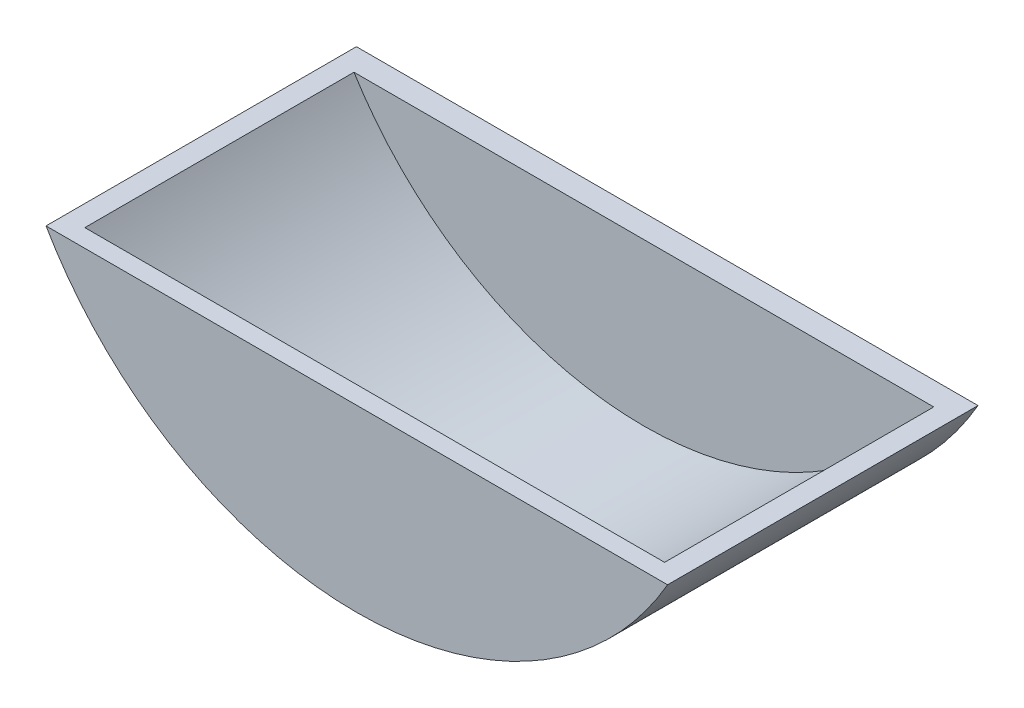
ISO-10303-21;
HEADER;
FILE_DESCRIPTION(('STEP AP214'),'2;1');
FILE_NAME('part.step','',(''),(''),'','','');
FILE_SCHEMA(('AUTOMOTIVE_DESIGN { 1 0 10303 214 1 1 1 1 }'));
ENDSEC;
DATA;
#1=APPLICATION_CONTEXT('core data for automotive mechanical design processes');
#2=APPLICATION_PROTOCOL_DEFINITION('international standard','automotive_design',2000,#1);
#3=PRODUCT_CONTEXT('',#1,'mechanical');
#4=PRODUCT('Part','Part','',(#3));
#5=PRODUCT_RELATED_PRODUCT_CATEGORY('part','',(#4));
#6=PRODUCT_DEFINITION_FORMATION('','',#4);
#7=PRODUCT_DEFINITION_CONTEXT('part definition',#1,'design');
#8=PRODUCT_DEFINITION('design','',#6,#7);
#9=PRODUCT_DEFINITION_SHAPE('','',#8);
#10=(LENGTH_UNIT() NAMED_UNIT(*) SI_UNIT(.MILLI.,.METRE.));
#11=(NAMED_UNIT(*) PLANE_ANGLE_UNIT() SI_UNIT($,.RADIAN.));
#12=(NAMED_UNIT(*) SI_UNIT($,.STERADIAN.) SOLID_ANGLE_UNIT());
#13=UNCERTAINTY_MEASURE_WITH_UNIT(LENGTH_MEASURE(1.E-05),#10,'distance_accuracy_value','');
#14=(GEOMETRIC_REPRESENTATION_CONTEXT(3) GLOBAL_UNCERTAINTY_ASSIGNED_CONTEXT((#13)) GLOBAL_UNIT_ASSIGNED_CONTEXT((#10,
#11,#12)) REPRESENTATION_CONTEXT('',''));
#15=CARTESIAN_POINT('',(0.,0.,0.));
#16=DIRECTION('',(0.,0.,1.));
#17=DIRECTION('',(1.,0.,0.));
#18=AXIS2_PLACEMENT_3D('',#15,#16,#17);
#19=CARTESIAN_POINT('',(0.,0.,-13.));
#20=DIRECTION('',(0.,0.,-1.));
#21=DIRECTION('',(-1.,0.,0.));
#22=AXIS2_PLACEMENT_3D('',#19,#20,#21);
#23=PLANE('',#22);
#24=CARTESIAN_POINT('',(0.,0.,-13.));
#25=DIRECTION('',(0.,0.,-1.));
#26=DIRECTION('',(-1.,0.,0.));
#27=AXIS2_PLACEMENT_3D('',#24,#25,#26);
#28=CIRCLE('',#27,200.);
#29=CARTESIAN_POINT('',(173.205080756888,-100.,-13.));
#30=VERTEX_POINT('',#29);
#31=CARTESIAN_POINT('',(-173.205080756888,-100.,-13.));
#32=VERTEX_POINT('',#31);
#33=EDGE_CURVE('E127',#30,#32,#28,.T.);
#34=ORIENTED_EDGE('',*,*,#33,.T.);
#35=DIRECTION('',(1.,0.,0.));
#36=VECTOR('',#35,1.);
#37=CARTESIAN_POINT('',(173.205080756888,-100.,-13.));
#38=LINE('',#37,#36);
#39=EDGE_CURVE('E152',#32,#30,#38,.T.);
#40=ORIENTED_EDGE('',*,*,#39,.T.);
#41=EDGE_LOOP('',(#34,#40));
#42=FACE_BOUND('',#41,.T.);
#43=DIRECTION('',(-1.,0.,0.));
#44=VECTOR('',#43,1.);
#45=CARTESIAN_POINT('',(-25.0000000000001,-134.311563909938,-13.));
#46=LINE('',#45,#44);
#47=CARTESIAN_POINT('',(25.9999999999999,-134.311563909938,-13.));
#48=VERTEX_POINT('',#47);
#49=CARTESIAN_POINT('',(-26.0000000000001,-134.311563909938,-13.));
#50=VERTEX_POINT('',#49);
#51=EDGE_CURVE('E173',#48,#50,#46,.T.);
#52=ORIENTED_EDGE('',*,*,#51,.T.);
#53=DIRECTION('',(0.,1.,0.));
#54=VECTOR('',#53,1.);
#55=CARTESIAN_POINT('',(-26.0000000000001,-150.293943782804,-13.));
#56=LINE('',#55,#54);
#57=CARTESIAN_POINT('',(-26.0000000000001,-151.293943782804,-13.));
#58=VERTEX_POINT('',#57);
#59=EDGE_CURVE('E189',#50,#58,#56,.F.);
#60=ORIENTED_EDGE('',*,*,#59,.T.);
#61=DIRECTION('',(-1.,0.,0.));
#62=VECTOR('',#61,1.);
#63=CARTESIAN_POINT('',(24.9999999999999,-151.293943782804,-13.));
#64=LINE('',#63,#62);
#65=CARTESIAN_POINT('',(25.9999999999999,-151.293943782804,-13.));
#66=VERTEX_POINT('',#65);
#67=EDGE_CURVE('E187',#58,#66,#64,.F.);
#68=ORIENTED_EDGE('',*,*,#67,.T.);
#69=DIRECTION('',(0.,1.,0.));
#70=VECTOR('',#69,1.);
#71=CARTESIAN_POINT('',(25.9999999999999,0.,-13.));
#72=LINE('',#71,#70);
#73=EDGE_CURVE('E184',#66,#48,#72,.T.);
#74=ORIENTED_EDGE('',*,*,#73,.T.);
#75=EDGE_LOOP('',(#52,#60,#68,#74));
#76=FACE_BOUND('',#75,.T.);
#77=ADVANCED_FACE('F41',(#42,#76),#23,.T.);
#78=CARTESIAN_POINT('',(0.,0.,150.));
#79=DIRECTION('',(0.,0.,-1.));
#80=DIRECTION('',(-1.,0.,0.));
#81=AXIS2_PLACEMENT_3D('',#78,#79,#80);
#82=CYLINDRICAL_SURFACE('',#81,190.);
#83=CARTESIAN_POINT('',(0.,0.,0.));
#84=DIRECTION('',(0.,0.,1.));
#85=DIRECTION('',(1.,0.,0.));
#86=AXIS2_PLACEMENT_3D('',#83,#84,#85);
#87=CIRCLE('',#86,190.);
#88=CARTESIAN_POINT('',(-161.554944214035,-100.,0.));
#89=VERTEX_POINT('',#88);
#90=CARTESIAN_POINT('',(161.554944214035,-100.,0.));
#91=VERTEX_POINT('',#90);
#92=EDGE_CURVE('E154',#89,#91,#87,.T.);
#93=ORIENTED_EDGE('',*,*,#92,.F.);
#94=DIRECTION('',(0.,0.,-1.));
#95=VECTOR('',#94,1.);
#96=CARTESIAN_POINT('',(-161.554944214035,-100.,150.));
#97=LINE('',#96,#95);
#98=CARTESIAN_POINT('',(-161.554944214035,-100.,150.));
#99=VERTEX_POINT('',#98);
#100=EDGE_CURVE('E164',#99,#89,#97,.T.);
#101=ORIENTED_EDGE('',*,*,#100,.F.);
#102=CARTESIAN_POINT('',(0.,0.,150.));
#103=DIRECTION('',(0.,0.,1.));
#104=DIRECTION('',(1.,0.,0.));
#105=AXIS2_PLACEMENT_3D('',#102,#103,#104);
#106=CIRCLE('',#105,190.);
#107=CARTESIAN_POINT('',(161.554944214035,-100.,150.));
#108=VERTEX_POINT('',#107);
#109=EDGE_CURVE('E157',#99,#108,#106,.T.);
#110=ORIENTED_EDGE('',*,*,#109,.T.);
#111=DIRECTION('',(0.,0.,-1.));
#112=VECTOR('',#111,1.);
#113=CARTESIAN_POINT('',(161.554944214035,-100.,150.));
#114=LINE('',#113,#112);
#115=EDGE_CURVE('E132',#108,#91,#114,.T.);
#116=ORIENTED_EDGE('',*,*,#115,.T.);
#117=EDGE_LOOP('',(#93,#101,#110,#116));
#118=FACE_BOUND('',#117,.T.);
#119=ADVANCED_FACE('F221',(#118),#82,.F.);
#120=CARTESIAN_POINT('',(0.,0.,150.));
#121=DIRECTION('',(0.,0.,-1.));
#122=DIRECTION('',(-1.,0.,0.));
#123=AXIS2_PLACEMENT_3D('',#120,#121,#122);
#124=CYLINDRICAL_SURFACE('',#123,200.);
#125=DIRECTION('',(0.,0.,-1.));
#126=VECTOR('',#125,1.);
#127=CARTESIAN_POINT('',(-173.205080756888,-100.,150.));
#128=LINE('',#127,#126);
#129=CARTESIAN_POINT('',(-173.205080756888,-100.,160.));
#130=VERTEX_POINT('',#129);
#131=EDGE_CURVE('E131',#130,#32,#128,.T.);
#132=ORIENTED_EDGE('',*,*,#131,.T.);
#133=ORIENTED_EDGE('',*,*,#33,.F.);
#134=DIRECTION('',(0.,0.,-1.));
#135=VECTOR('',#134,1.);
#136=CARTESIAN_POINT('',(173.205080756888,-100.,150.));
#137=LINE('',#136,#135);
#138=CARTESIAN_POINT('',(173.205080756888,-100.,160.));
#139=VERTEX_POINT('',#138);
#140=EDGE_CURVE('E121',#139,#30,#137,.T.);
#141=ORIENTED_EDGE('',*,*,#140,.F.);
#142=CARTESIAN_POINT('',(0.,0.,160.));
#143=DIRECTION('',(0.,0.,1.));
#144=DIRECTION('',(1.,0.,0.));
#145=AXIS2_PLACEMENT_3D('',#142,#143,#144);
#146=CIRCLE('',#145,200.);
#147=EDGE_CURVE('E125',#130,#139,#146,.T.);
#148=ORIENTED_EDGE('',*,*,#147,.F.);
#149=EDGE_LOOP('',(#132,#133,#141,#148));
#150=FACE_BOUND('',#149,.T.);
#151=ADVANCED_FACE('F123',(#150),#124,.T.);
#152=CARTESIAN_POINT('',(0.,-100.,150.));
#153=DIRECTION('',(0.,1.,0.));
#154=DIRECTION('',(-1.,0.,0.));
#155=AXIS2_PLACEMENT_3D('',#152,#153,#154);
#156=PLANE('',#155);
#157=ORIENTED_EDGE('',*,*,#131,.F.);
#158=DIRECTION('',(-1.,0.,0.));
#159=VECTOR('',#158,1.);
#160=CARTESIAN_POINT('',(-173.205080756888,-100.,160.));
#161=LINE('',#160,#159);
#162=EDGE_CURVE('E135',#139,#130,#161,.T.);
#163=ORIENTED_EDGE('',*,*,#162,.F.);
#164=ORIENTED_EDGE('',*,*,#140,.T.);
#165=ORIENTED_EDGE('',*,*,#39,.F.);
#166=EDGE_LOOP('',(#157,#163,#164,#165));
#167=FACE_BOUND('',#166,.T.);
#168=DIRECTION('',(-1.,0.,0.));
#169=VECTOR('',#168,1.);
#170=CARTESIAN_POINT('',(-173.205080756888,-100.,150.));
#171=LINE('',#170,#169);
#172=EDGE_CURVE('E142',#108,#99,#171,.T.);
#173=ORIENTED_EDGE('',*,*,#172,.T.);
#174=ORIENTED_EDGE('',*,*,#100,.T.);
#175=DIRECTION('',(1.,0.,0.));
#176=VECTOR('',#175,1.);
#177=CARTESIAN_POINT('',(173.205080756888,-100.,0.));
#178=LINE('',#177,#176);
#179=EDGE_CURVE('E139',#89,#91,#178,.T.);
#180=ORIENTED_EDGE('',*,*,#179,.T.);
#181=ORIENTED_EDGE('',*,*,#115,.F.);
#182=EDGE_LOOP('',(#173,#174,#180,#181));
#183=FACE_BOUND('',#182,.T.);
#184=ADVANCED_FACE('F136',(#167,#183),#156,.T.);
#185=CARTESIAN_POINT('',(0.,0.,0.));
#186=DIRECTION('',(0.,0.,-1.));
#187=DIRECTION('',(-1.,0.,0.));
#188=AXIS2_PLACEMENT_3D('',#185,#186,#187);
#189=PLANE('',#188);
#190=ORIENTED_EDGE('',*,*,#179,.F.);
#191=ORIENTED_EDGE('',*,*,#92,.T.);
#192=EDGE_LOOP('',(#190,#191));
#193=FACE_BOUND('',#192,.T.);
#194=ADVANCED_FACE('F233',(#193),#189,.F.);
#195=CARTESIAN_POINT('',(0.,0.,150.));
#196=DIRECTION('',(0.,0.,1.));
#197=DIRECTION('',(1.,0.,0.));
#198=AXIS2_PLACEMENT_3D('',#195,#196,#197);
#199=PLANE('',#198);
#200=ORIENTED_EDGE('',*,*,#109,.F.);
#201=ORIENTED_EDGE('',*,*,#172,.F.);
#202=EDGE_LOOP('',(#200,#201));
#203=FACE_BOUND('',#202,.T.);
#204=ADVANCED_FACE('F231',(#203),#199,.F.);
#205=CARTESIAN_POINT('',(0.,0.,160.));
#206=DIRECTION('',(0.,0.,1.));
#207=DIRECTION('',(1.,0.,0.));
#208=AXIS2_PLACEMENT_3D('',#205,#206,#207);
#209=PLANE('',#208);
#210=ORIENTED_EDGE('',*,*,#147,.T.);
#211=ORIENTED_EDGE('',*,*,#162,.T.);
#212=EDGE_LOOP('',(#210,#211));
#213=FACE_BOUND('',#212,.T.);
#214=ADVANCED_FACE('F141',(#213),#209,.T.);
#215=CARTESIAN_POINT('',(-25.0000000000001,0.,-3.));
#216=DIRECTION('',(-1.,0.,0.));
#217=DIRECTION('',(0.,0.,1.));
#218=AXIS2_PLACEMENT_3D('',#215,#216,#217);
#219=PLANE('',#218);
#220=DIRECTION('',(0.,0.,-1.));
#221=VECTOR('',#220,1.);
#222=CARTESIAN_POINT('',(-25.0000000000001,-150.293943782804,-3.));
#223=LINE('',#222,#221);
#224=CARTESIAN_POINT('',(-25.0000000000001,-150.293943782804,-3.00067343296818));
#225=VERTEX_POINT('',#224);
#226=CARTESIAN_POINT('',(-25.0000000000001,-150.293943782804,-12.));
#227=VERTEX_POINT('',#226);
#228=EDGE_CURVE('E145',#225,#227,#223,.T.);
#229=ORIENTED_EDGE('',*,*,#228,.T.);
#230=DIRECTION('',(0.,1.,0.));
#231=VECTOR('',#230,1.);
#232=CARTESIAN_POINT('',(-25.0000000000001,-134.311563909938,-12.));
#233=LINE('',#232,#231);
#234=CARTESIAN_POINT('',(-25.0000000000001,-136.547631887437,-12.));
#235=VERTEX_POINT('',#234);
#236=EDGE_CURVE('E65',#227,#235,#233,.T.);
#237=ORIENTED_EDGE('',*,*,#236,.T.);
#238=CARTESIAN_POINT('',(-25.0000000000001,-134.311563909938,-10.));
#239=DIRECTION('',(-1.,0.,0.));
#240=DIRECTION('',(0.,0.,1.));
#241=AXIS2_PLACEMENT_3D('',#238,#239,#240);
#242=CIRCLE('',#241,3.);
#243=CARTESIAN_POINT('',(-25.0000000000001,-136.998983159371,-11.3333333333333));
#244=VERTEX_POINT('',#243);
#245=EDGE_CURVE('E177',#235,#244,#242,.T.);
#246=ORIENTED_EDGE('',*,*,#245,.T.);
#247=CARTESIAN_POINT('',(-25.0000000000001,-150.436079406535,-18.));
#248=DIRECTION('',(-1.,0.,0.));
#249=DIRECTION('',(0.,0.,1.));
#250=AXIS2_PLACEMENT_3D('',#247,#248,#249);
#251=CIRCLE('',#250,15.);
#252=EDGE_CURVE('E166',#244,#225,#251,.F.);
#253=ORIENTED_EDGE('',*,*,#252,.T.);
#254=EDGE_LOOP('',(#229,#237,#246,#253));
#255=FACE_BOUND('',#254,.T.);
#256=ADVANCED_FACE('F264',(#255),#219,.F.);
#257=CARTESIAN_POINT('',(0.,-150.293943782804,-3.));
#258=DIRECTION('',(0.,-1.,0.));
#259=DIRECTION('',(0.,0.,-1.));
#260=AXIS2_PLACEMENT_3D('',#257,#258,#259);
#261=PLANE('',#260);
#262=DIRECTION('',(0.,0.,-1.));
#263=VECTOR('',#262,1.);
#264=CARTESIAN_POINT('',(24.9999999999999,-150.293943782804,-3.));
#265=LINE('',#264,#263);
#266=CARTESIAN_POINT('',(24.9999999999999,-150.293943782804,-3.00067343296818));
#267=VERTEX_POINT('',#266);
#268=CARTESIAN_POINT('',(24.9999999999999,-150.293943782804,-12.));
#269=VERTEX_POINT('',#268);
#270=EDGE_CURVE('E148',#267,#269,#265,.T.);
#271=ORIENTED_EDGE('',*,*,#270,.T.);
#272=DIRECTION('',(-1.,0.,0.));
#273=VECTOR('',#272,1.);
#274=CARTESIAN_POINT('',(-25.0000000000001,-150.293943782804,-12.));
#275=LINE('',#274,#273);
#276=EDGE_CURVE('E181',#269,#227,#275,.T.);
#277=ORIENTED_EDGE('',*,*,#276,.T.);
#278=ORIENTED_EDGE('',*,*,#228,.F.);
#279=DIRECTION('',(1.,0.,0.));
#280=VECTOR('',#279,1.);
#281=CARTESIAN_POINT('',(0.,-150.293943782804,-3.00067343296818));
#282=LINE('',#281,#280);
#283=EDGE_CURVE('E168',#225,#267,#282,.T.);
#284=ORIENTED_EDGE('',*,*,#283,.T.);
#285=EDGE_LOOP('',(#271,#277,#278,#284));
#286=FACE_BOUND('',#285,.T.);
#287=ADVANCED_FACE('F271',(#286),#261,.F.);
#288=CARTESIAN_POINT('',(24.9999999999999,0.,-3.));
#289=DIRECTION('',(-1.,0.,0.));
#290=DIRECTION('',(0.,0.,1.));
#291=AXIS2_PLACEMENT_3D('',#288,#289,#290);
#292=PLANE('',#291);
#293=CARTESIAN_POINT('',(24.9999999999999,-134.311563909938,-10.));
#294=DIRECTION('',(-1.,0.,0.));
#295=DIRECTION('',(0.,0.,1.));
#296=AXIS2_PLACEMENT_3D('',#293,#294,#295);
#297=CIRCLE('',#296,3.);
#298=CARTESIAN_POINT('',(24.9999999999999,-136.998983159371,-11.3333333333333));
#299=VERTEX_POINT('',#298);
#300=CARTESIAN_POINT('',(24.9999999999999,-136.547631887437,-12.));
#301=VERTEX_POINT('',#300);
#302=EDGE_CURVE('E179',#299,#301,#297,.F.);
#303=ORIENTED_EDGE('',*,*,#302,.T.);
#304=DIRECTION('',(0.,1.,0.));
#305=VECTOR('',#304,1.);
#306=CARTESIAN_POINT('',(24.9999999999999,0.,-12.));
#307=LINE('',#306,#305);
#308=EDGE_CURVE('E192',#301,#269,#307,.F.);
#309=ORIENTED_EDGE('',*,*,#308,.T.);
#310=ORIENTED_EDGE('',*,*,#270,.F.);
#311=CARTESIAN_POINT('',(24.9999999999999,-150.436079406535,-18.));
#312=DIRECTION('',(-1.,0.,0.));
#313=DIRECTION('',(0.,0.,1.));
#314=AXIS2_PLACEMENT_3D('',#311,#312,#313);
#315=CIRCLE('',#314,15.);
#316=EDGE_CURVE('E170',#267,#299,#315,.T.);
#317=ORIENTED_EDGE('',*,*,#316,.T.);
#318=EDGE_LOOP('',(#303,#309,#310,#317));
#319=FACE_BOUND('',#318,.T.);
#320=ADVANCED_FACE('F278',(#319),#292,.T.);
#321=CARTESIAN_POINT('',(0.,-150.436079406535,-18.));
#322=DIRECTION('',(1.,0.,0.));
#323=DIRECTION('',(0.,0.,-1.));
#324=AXIS2_PLACEMENT_3D('',#321,#322,#323);
#325=CYLINDRICAL_SURFACE('',#324,15.);
#326=ORIENTED_EDGE('',*,*,#252,.F.);
#327=DIRECTION('',(1.,0.,0.));
#328=VECTOR('',#327,1.);
#329=CARTESIAN_POINT('',(0.,-136.998983159371,-11.3333333333333));
#330=LINE('',#329,#328);
#331=EDGE_CURVE('E175',#244,#299,#330,.T.);
#332=ORIENTED_EDGE('',*,*,#331,.T.);
#333=ORIENTED_EDGE('',*,*,#316,.F.);
#334=ORIENTED_EDGE('',*,*,#283,.F.);
#335=EDGE_LOOP('',(#326,#332,#333,#334));
#336=FACE_BOUND('',#335,.T.);
#337=ADVANCED_FACE('F209',(#336),#325,.F.);
#338=CARTESIAN_POINT('',(0.,-134.311563909938,-10.));
#339=DIRECTION('',(1.,0.,0.));
#340=DIRECTION('',(0.,0.,-1.));
#341=AXIS2_PLACEMENT_3D('',#338,#339,#340);
#342=CYLINDRICAL_SURFACE('',#341,3.);
#343=ORIENTED_EDGE('',*,*,#302,.F.);
#344=ORIENTED_EDGE('',*,*,#331,.F.);
#345=ORIENTED_EDGE('',*,*,#245,.F.);
#346=CARTESIAN_POINT('',(-25.0000000000001,-136.547631887437,-12.));
#347=CARTESIAN_POINT('',(-25.0000045555108,-136.519321203645,-12.0316578772173));
#348=CARTESIAN_POINT('',(-25.001502630521,-136.490352491573,-12.062687444377));
#349=CARTESIAN_POINT('',(-25.0071669851849,-136.431291326145,-12.1233321725057));
#350=CARTESIAN_POINT('',(-25.0113298709754,-136.40120034793,-12.152949081136));
#351=CARTESIAN_POINT('',(-25.0272642318095,-136.309884057287,-12.2391262742663));
#352=CARTESIAN_POINT('',(-25.0424913092059,-136.247182744963,-12.2934948471067));
#353=CARTESIAN_POINT('',(-25.0924370178181,-136.076708411475,-12.4295613572291));
#354=CARTESIAN_POINT('',(-25.1333888247123,-135.966389855434,-12.5057446330973));
#355=CARTESIAN_POINT('',(-25.228187305914,-135.740336272819,-12.6412372779232));
#356=CARTESIAN_POINT('',(-25.2821131783341,-135.624571635852,-12.7004379140891));
#357=CARTESIAN_POINT('',(-25.3814590733247,-135.423849076652,-12.7876689239468));
#358=CARTESIAN_POINT('',(-25.4248612514738,-135.339612377373,-12.819766680889));
#359=CARTESIAN_POINT('',(-25.5146643361153,-135.170051029085,-12.8759320021476));
#360=CARTESIAN_POINT('',(-25.5610667415802,-135.084725853608,-12.8999955148087));
#361=CARTESIAN_POINT('',(-25.7030365805707,-134.828125951912,-12.960402907647));
#362=CARTESIAN_POINT('',(-25.8016660196175,-134.655645549449,-12.9852102334562));
#363=CARTESIAN_POINT('',(-25.9321423018868,-134.42910701717,-12.9981840462985));
#364=CARTESIAN_POINT('',(-25.9633277351829,-134.375082691065,-12.9998141662826));
#365=CARTESIAN_POINT('',(-25.9963484941438,-134.31788849544,-12.9999949980915));
#366=CARTESIAN_POINT('',(-25.9981742368466,-134.314726216128,-12.9999999978197));
#367=CARTESIAN_POINT('',(-26.0000000000001,-134.311563909938,-13.));
#368=B_SPLINE_CURVE_WITH_KNOTS('',3,(#346,#347,#348,#349,#350,#351,#352,#353,#354,#355,#356,
#357,#358,#359,#360,#361,#362,#363,#364,#365,#366,#367),.UNSPECIFIED.,.F.,.F.,(4,2,2,2,2,2,2,2,
2,2,4),(0.,0.127328124372196,0.254494407314552,0.50690275884799,0.925154347494182,
1.34602692875661,1.64578712718782,1.94569826663471,2.54344782717992,2.73062158792371,
2.7415760493441),.UNSPECIFIED.);
#369=EDGE_CURVE('E51',#235,#50,#368,.T.);
#370=ORIENTED_EDGE('',*,*,#369,.T.);
#371=ORIENTED_EDGE('',*,*,#51,.F.);
#372=CARTESIAN_POINT('',(24.9999999999999,-136.547631887437,-12.));
#373=CARTESIAN_POINT('',(25.0000045555107,-136.519321203645,-12.0316578772173));
#374=CARTESIAN_POINT('',(25.0015026305209,-136.490352491573,-12.062687444377));
#375=CARTESIAN_POINT('',(25.0071669851848,-136.431291326145,-12.1233321725057));
#376=CARTESIAN_POINT('',(25.0113298709752,-136.40120034793,-12.152949081136));
#377=CARTESIAN_POINT('',(25.0272642318094,-136.309884057287,-12.2391262742663));
#378=CARTESIAN_POINT('',(25.0424913092057,-136.247182744963,-12.2934948471067));
#379=CARTESIAN_POINT('',(25.0924370178179,-136.076708411475,-12.4295613572291));
#380=CARTESIAN_POINT('',(25.1333888247122,-135.966389855434,-12.5057446330973));
#381=CARTESIAN_POINT('',(25.2281873059138,-135.740336272819,-12.6412372779232));
#382=CARTESIAN_POINT('',(25.2821131783339,-135.624571635852,-12.7004379140891));
#383=CARTESIAN_POINT('',(25.3814590733246,-135.423849076652,-12.7876689239468));
#384=CARTESIAN_POINT('',(25.4248612514737,-135.339612377373,-12.819766680889));
#385=CARTESIAN_POINT('',(25.5146643361151,-135.170051029085,-12.8759320021476));
#386=CARTESIAN_POINT('',(25.5610667415801,-135.084725853608,-12.8999955148087));
#387=CARTESIAN_POINT('',(25.7030365805706,-134.828125951912,-12.960402907647));
#388=CARTESIAN_POINT('',(25.8016660196174,-134.655645549449,-12.9852102334562));
#389=CARTESIAN_POINT('',(25.9321423018867,-134.42910701717,-12.9981840462985));
#390=CARTESIAN_POINT('',(25.9633277351828,-134.375082691065,-12.9998141662826));
#391=CARTESIAN_POINT('',(25.9963484941437,-134.31788849544,-12.9999949980915));
#392=CARTESIAN_POINT('',(25.9981742368465,-134.314726216128,-12.9999999978197));
#393=CARTESIAN_POINT('',(25.9999999999999,-134.311563909938,-13.));
#394=B_SPLINE_CURVE_WITH_KNOTS('',3,(#372,#373,#374,#375,#376,#377,#378,#379,#380,#381,#382,
#383,#384,#385,#386,#387,#388,#389,#390,#391,#392,#393),.UNSPECIFIED.,.F.,.F.,(4,2,2,2,2,2,2,2,
2,2,4),(0.,0.127328124372196,0.254494407314552,0.50690275884799,0.925154347494182,
1.34602692875661,1.64578712718782,1.94569826663471,2.54344782717992,2.73062158792371,
2.7415760493441),.UNSPECIFIED.);
#395=EDGE_CURVE('E11',#48,#301,#394,.F.);
#396=ORIENTED_EDGE('',*,*,#395,.T.);
#397=EDGE_LOOP('',(#343,#344,#345,#370,#371,#396));
#398=FACE_BOUND('',#397,.T.);
#399=ADVANCED_FACE('F205',(#398),#342,.T.);
#400=CARTESIAN_POINT('',(25.9999999999999,0.,-12.));
#401=DIRECTION('',(0.,1.,0.));
#402=DIRECTION('',(0.,0.,1.));
#403=AXIS2_PLACEMENT_3D('',#400,#401,#402);
#404=CYLINDRICAL_SURFACE('',#403,1.);
#405=ORIENTED_EDGE('',*,*,#395,.F.);
#406=ORIENTED_EDGE('',*,*,#73,.F.);
#407=CARTESIAN_POINT('',(25.9999999999999,-151.293943782804,-12.));
#408=DIRECTION('',(0.707106781186547,0.707106781186547,0.));
#409=DIRECTION('',(0.707106781186547,-0.707106781186547,0.));
#410=AXIS2_PLACEMENT_3D('',#407,#408,#409);
#411=ELLIPSE('',#410,1.41421356237309,1.);
#412=EDGE_CURVE('E46',#269,#66,#411,.F.);
#413=ORIENTED_EDGE('',*,*,#412,.F.);
#414=ORIENTED_EDGE('',*,*,#308,.F.);
#415=EDGE_LOOP('',(#405,#406,#413,#414));
#416=FACE_BOUND('',#415,.T.);
#417=ADVANCED_FACE('F43',(#416),#404,.T.);
#418=CARTESIAN_POINT('',(-26.0000000000001,0.,-12.));
#419=DIRECTION('',(0.,-1.,0.));
#420=DIRECTION('',(0.,0.,-1.));
#421=AXIS2_PLACEMENT_3D('',#418,#419,#420);
#422=CYLINDRICAL_SURFACE('',#421,1.);
#423=ORIENTED_EDGE('',*,*,#369,.F.);
#424=ORIENTED_EDGE('',*,*,#236,.F.);
#425=CARTESIAN_POINT('',(-26.0000000000001,-151.293943782804,-12.));
#426=DIRECTION('',(0.707106781186547,-0.707106781186547,0.));
#427=DIRECTION('',(0.707106781186547,0.707106781186547,0.));
#428=AXIS2_PLACEMENT_3D('',#425,#426,#427);
#429=ELLIPSE('',#428,1.41421356237309,1.);
#430=EDGE_CURVE('E371',#58,#227,#429,.T.);
#431=ORIENTED_EDGE('',*,*,#430,.F.);
#432=ORIENTED_EDGE('',*,*,#59,.F.);
#433=EDGE_LOOP('',(#423,#424,#431,#432));
#434=FACE_BOUND('',#433,.T.);
#435=ADVANCED_FACE('F202',(#434),#422,.T.);
#436=CARTESIAN_POINT('',(0.,-151.293943782804,-12.));
#437=DIRECTION('',(1.,0.,0.));
#438=DIRECTION('',(0.,0.,-1.));
#439=AXIS2_PLACEMENT_3D('',#436,#437,#438);
#440=CYLINDRICAL_SURFACE('',#439,1.);
#441=ORIENTED_EDGE('',*,*,#412,.T.);
#442=ORIENTED_EDGE('',*,*,#67,.F.);
#443=ORIENTED_EDGE('',*,*,#430,.T.);
#444=ORIENTED_EDGE('',*,*,#276,.F.);
#445=EDGE_LOOP('',(#441,#442,#443,#444));
#446=FACE_BOUND('',#445,.T.);
#447=ADVANCED_FACE('F211',(#446),#440,.T.);
#448=CLOSED_SHELL('',(#77,#119,#151,#184,#194,#204,#214,#256,#287,#320,#337,#399,#417,#435,#447));
#449=MANIFOLD_SOLID_BREP('B2',#448);
#450=ADVANCED_BREP_SHAPE_REPRESENTATION('',(#18,#449),#14);
#451=SHAPE_DEFINITION_REPRESENTATION(#9,#450);
ENDSEC;
END-ISO-10303-21;
